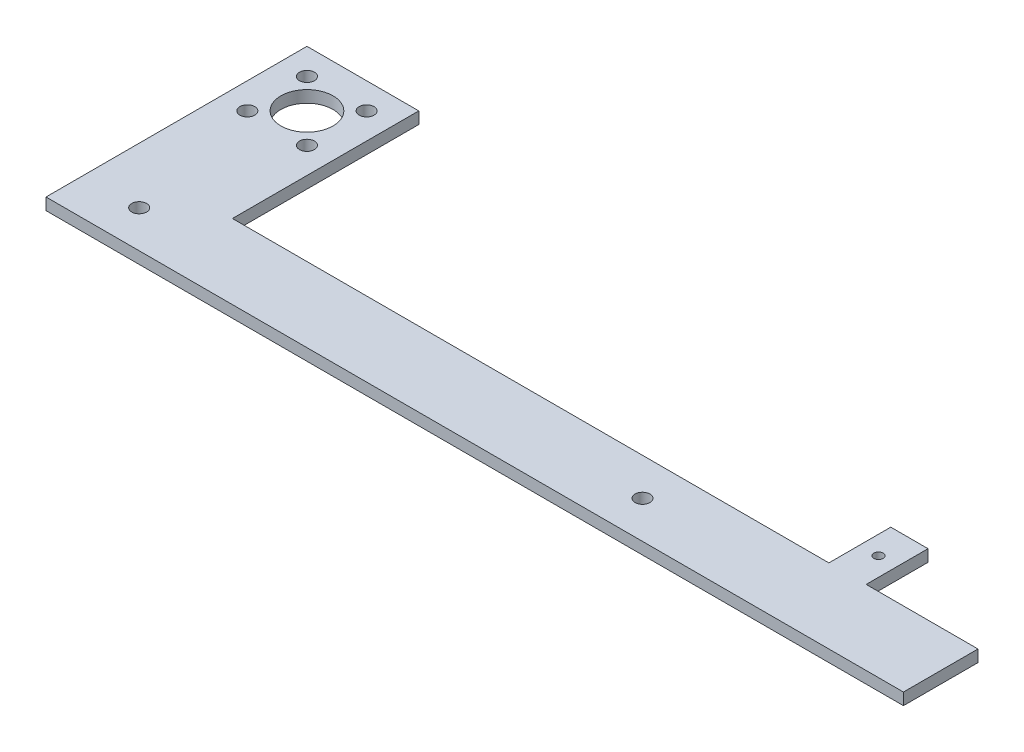
ISO-10303-21;
HEADER;
FILE_DESCRIPTION(('STEP AP214'),'2;1');
FILE_NAME('part.step','',(''),(''),'','','');
FILE_SCHEMA(('AUTOMOTIVE_DESIGN { 1 0 10303 214 1 1 1 1 }'));
ENDSEC;
DATA;
#1=APPLICATION_CONTEXT('core data for automotive mechanical design processes');
#2=APPLICATION_PROTOCOL_DEFINITION('international standard','automotive_design',2000,#1);
#3=PRODUCT_CONTEXT('',#1,'mechanical');
#4=PRODUCT('Part','Part','',(#3));
#5=PRODUCT_RELATED_PRODUCT_CATEGORY('part','',(#4));
#6=PRODUCT_DEFINITION_FORMATION('','',#4);
#7=PRODUCT_DEFINITION_CONTEXT('part definition',#1,'design');
#8=PRODUCT_DEFINITION('design','',#6,#7);
#9=PRODUCT_DEFINITION_SHAPE('','',#8);
#10=(LENGTH_UNIT() NAMED_UNIT(*) SI_UNIT(.MILLI.,.METRE.));
#11=(NAMED_UNIT(*) PLANE_ANGLE_UNIT() SI_UNIT($,.RADIAN.));
#12=(NAMED_UNIT(*) SI_UNIT($,.STERADIAN.) SOLID_ANGLE_UNIT());
#13=UNCERTAINTY_MEASURE_WITH_UNIT(LENGTH_MEASURE(1.E-05),#10,'distance_accuracy_value','');
#14=(GEOMETRIC_REPRESENTATION_CONTEXT(3) GLOBAL_UNCERTAINTY_ASSIGNED_CONTEXT((#13)) GLOBAL_UNIT_ASSIGNED_CONTEXT((#10,
#11,#12)) REPRESENTATION_CONTEXT('',''));
#15=CARTESIAN_POINT('',(0.,0.,0.));
#16=DIRECTION('',(0.,0.,1.));
#17=DIRECTION('',(1.,0.,0.));
#18=AXIS2_PLACEMENT_3D('',#15,#16,#17);
#19=CARTESIAN_POINT('',(0.,3.175,0.));
#20=DIRECTION('',(0.,0.,-1.));
#21=DIRECTION('',(-1.,0.,0.));
#22=AXIS2_PLACEMENT_3D('',#19,#20,#21);
#23=PLANE('',#22);
#24=DIRECTION('',(1.,0.,0.));
#25=VECTOR('',#24,1.);
#26=CARTESIAN_POINT('',(0.,0.,0.));
#27=LINE('',#26,#25);
#28=CARTESIAN_POINT('',(0.,0.,0.));
#29=VERTEX_POINT('',#28);
#30=CARTESIAN_POINT('',(230.,0.,0.));
#31=VERTEX_POINT('',#30);
#32=EDGE_CURVE('E170',#29,#31,#27,.T.);
#33=ORIENTED_EDGE('',*,*,#32,.T.);
#34=DIRECTION('',(0.,-1.,0.));
#35=VECTOR('',#34,1.);
#36=CARTESIAN_POINT('',(230.,3.175,0.));
#37=LINE('',#36,#35);
#38=CARTESIAN_POINT('',(230.,3.175,0.));
#39=VERTEX_POINT('',#38);
#40=EDGE_CURVE('E11',#39,#31,#37,.T.);
#41=ORIENTED_EDGE('',*,*,#40,.F.);
#42=DIRECTION('',(1.,0.,0.));
#43=VECTOR('',#42,1.);
#44=CARTESIAN_POINT('',(0.,3.175,0.));
#45=LINE('',#44,#43);
#46=CARTESIAN_POINT('',(0.,3.175,0.));
#47=VERTEX_POINT('',#46);
#48=EDGE_CURVE('E253',#47,#39,#45,.T.);
#49=ORIENTED_EDGE('',*,*,#48,.F.);
#50=DIRECTION('',(0.,-1.,0.));
#51=VECTOR('',#50,1.);
#52=CARTESIAN_POINT('',(0.,3.175,0.));
#53=LINE('',#52,#51);
#54=EDGE_CURVE('E52',#47,#29,#53,.T.);
#55=ORIENTED_EDGE('',*,*,#54,.T.);
#56=EDGE_LOOP('',(#33,#41,#49,#55));
#57=FACE_BOUND('',#56,.T.);
#58=ADVANCED_FACE('F35',(#57),#23,.F.);
#59=CARTESIAN_POINT('',(230.,3.175,0.));
#60=DIRECTION('',(-1.,0.,0.));
#61=DIRECTION('',(0.,0.,1.));
#62=AXIS2_PLACEMENT_3D('',#59,#60,#61);
#63=PLANE('',#62);
#64=DIRECTION('',(0.,0.,-1.));
#65=VECTOR('',#64,1.);
#66=CARTESIAN_POINT('',(230.,0.,0.));
#67=LINE('',#66,#65);
#68=CARTESIAN_POINT('',(230.,0.,-20.));
#69=VERTEX_POINT('',#68);
#70=EDGE_CURVE('E172',#31,#69,#67,.T.);
#71=ORIENTED_EDGE('',*,*,#70,.T.);
#72=DIRECTION('',(0.,-1.,0.));
#73=VECTOR('',#72,1.);
#74=CARTESIAN_POINT('',(230.,3.175,-20.));
#75=LINE('',#74,#73);
#76=CARTESIAN_POINT('',(230.,3.175,-20.));
#77=VERTEX_POINT('',#76);
#78=EDGE_CURVE('E44',#77,#69,#75,.T.);
#79=ORIENTED_EDGE('',*,*,#78,.F.);
#80=DIRECTION('',(0.,0.,-1.));
#81=VECTOR('',#80,1.);
#82=CARTESIAN_POINT('',(230.,3.175,0.));
#83=LINE('',#82,#81);
#84=EDGE_CURVE('E97',#39,#77,#83,.T.);
#85=ORIENTED_EDGE('',*,*,#84,.F.);
#86=ORIENTED_EDGE('',*,*,#40,.T.);
#87=EDGE_LOOP('',(#71,#79,#85,#86));
#88=FACE_BOUND('',#87,.T.);
#89=ADVANCED_FACE('F229',(#88),#63,.F.);
#90=CARTESIAN_POINT('',(0.,3.175,-20.));
#91=DIRECTION('',(0.,0.,-1.));
#92=DIRECTION('',(-1.,0.,0.));
#93=AXIS2_PLACEMENT_3D('',#90,#91,#92);
#94=PLANE('',#93);
#95=DIRECTION('',(1.,0.,0.));
#96=VECTOR('',#95,1.);
#97=CARTESIAN_POINT('',(0.,0.,-20.));
#98=LINE('',#97,#96);
#99=CARTESIAN_POINT('',(200.,0.,-20.));
#100=VERTEX_POINT('',#99);
#101=EDGE_CURVE('E175',#100,#69,#98,.T.);
#102=ORIENTED_EDGE('',*,*,#101,.F.);
#103=DIRECTION('',(0.,-1.,0.));
#104=VECTOR('',#103,1.);
#105=CARTESIAN_POINT('',(200.,3.175,-20.));
#106=LINE('',#105,#104);
#107=CARTESIAN_POINT('',(200.,3.175,-20.));
#108=VERTEX_POINT('',#107);
#109=EDGE_CURVE('E222',#108,#100,#106,.T.);
#110=ORIENTED_EDGE('',*,*,#109,.F.);
#111=DIRECTION('',(1.,0.,0.));
#112=VECTOR('',#111,1.);
#113=CARTESIAN_POINT('',(0.,3.175,-20.));
#114=LINE('',#113,#112);
#115=EDGE_CURVE('E228',#108,#77,#114,.T.);
#116=ORIENTED_EDGE('',*,*,#115,.T.);
#117=ORIENTED_EDGE('',*,*,#78,.T.);
#118=EDGE_LOOP('',(#102,#110,#116,#117));
#119=FACE_BOUND('',#118,.T.);
#120=ADVANCED_FACE('F226',(#119),#94,.T.);
#121=CARTESIAN_POINT('',(200.,3.175,0.));
#122=DIRECTION('',(-1.,0.,0.));
#123=DIRECTION('',(0.,0.,1.));
#124=AXIS2_PLACEMENT_3D('',#121,#122,#123);
#125=PLANE('',#124);
#126=DIRECTION('',(0.,0.,-1.));
#127=VECTOR('',#126,1.);
#128=CARTESIAN_POINT('',(200.,0.,0.));
#129=LINE('',#128,#127);
#130=CARTESIAN_POINT('',(200.,0.,-36.6));
#131=VERTEX_POINT('',#130);
#132=EDGE_CURVE('E178',#100,#131,#129,.T.);
#133=ORIENTED_EDGE('',*,*,#132,.T.);
#134=DIRECTION('',(0.,-1.,0.));
#135=VECTOR('',#134,1.);
#136=CARTESIAN_POINT('',(200.,3.175,-36.6));
#137=LINE('',#136,#135);
#138=CARTESIAN_POINT('',(200.,3.175,-36.6));
#139=VERTEX_POINT('',#138);
#140=EDGE_CURVE('E219',#139,#131,#137,.T.);
#141=ORIENTED_EDGE('',*,*,#140,.F.);
#142=DIRECTION('',(0.,0.,-1.));
#143=VECTOR('',#142,1.);
#144=CARTESIAN_POINT('',(200.,3.175,0.));
#145=LINE('',#144,#143);
#146=EDGE_CURVE('E247',#108,#139,#145,.T.);
#147=ORIENTED_EDGE('',*,*,#146,.F.);
#148=ORIENTED_EDGE('',*,*,#109,.T.);
#149=EDGE_LOOP('',(#133,#141,#147,#148));
#150=FACE_BOUND('',#149,.T.);
#151=ADVANCED_FACE('F238',(#150),#125,.F.);
#152=CARTESIAN_POINT('',(0.,3.175,-36.5999999999999));
#153=DIRECTION('',(0.,0.,1.));
#154=DIRECTION('',(1.,0.,0.));
#155=AXIS2_PLACEMENT_3D('',#152,#153,#154);
#156=PLANE('',#155);
#157=DIRECTION('',(-1.,0.,0.));
#158=VECTOR('',#157,1.);
#159=CARTESIAN_POINT('',(0.,0.,-36.5999999999999));
#160=LINE('',#159,#158);
#161=CARTESIAN_POINT('',(190.,0.,-36.6));
#162=VERTEX_POINT('',#161);
#163=EDGE_CURVE('E181',#131,#162,#160,.T.);
#164=ORIENTED_EDGE('',*,*,#163,.T.);
#165=DIRECTION('',(0.,-1.,0.));
#166=VECTOR('',#165,1.);
#167=CARTESIAN_POINT('',(190.,3.175,-36.6));
#168=LINE('',#167,#166);
#169=CARTESIAN_POINT('',(190.,3.175,-36.6));
#170=VERTEX_POINT('',#169);
#171=EDGE_CURVE('E217',#170,#162,#168,.T.);
#172=ORIENTED_EDGE('',*,*,#171,.F.);
#173=DIRECTION('',(-1.,0.,0.));
#174=VECTOR('',#173,1.);
#175=CARTESIAN_POINT('',(0.,3.175,-36.5999999999999));
#176=LINE('',#175,#174);
#177=EDGE_CURVE('E244',#139,#170,#176,.T.);
#178=ORIENTED_EDGE('',*,*,#177,.F.);
#179=ORIENTED_EDGE('',*,*,#140,.T.);
#180=EDGE_LOOP('',(#164,#172,#178,#179));
#181=FACE_BOUND('',#180,.T.);
#182=ADVANCED_FACE('F242',(#181),#156,.F.);
#183=CARTESIAN_POINT('',(190.,3.175,0.));
#184=DIRECTION('',(-1.,0.,0.));
#185=DIRECTION('',(0.,0.,1.));
#186=AXIS2_PLACEMENT_3D('',#183,#184,#185);
#187=PLANE('',#186);
#188=DIRECTION('',(0.,0.,-1.));
#189=VECTOR('',#188,1.);
#190=CARTESIAN_POINT('',(190.,0.,0.));
#191=LINE('',#190,#189);
#192=CARTESIAN_POINT('',(190.,0.,-20.));
#193=VERTEX_POINT('',#192);
#194=EDGE_CURVE('E184',#193,#162,#191,.T.);
#195=ORIENTED_EDGE('',*,*,#194,.F.);
#196=DIRECTION('',(0.,-1.,0.));
#197=VECTOR('',#196,1.);
#198=CARTESIAN_POINT('',(190.,3.175,-20.));
#199=LINE('',#198,#197);
#200=CARTESIAN_POINT('',(190.,3.175,-20.));
#201=VERTEX_POINT('',#200);
#202=EDGE_CURVE('E215',#201,#193,#199,.T.);
#203=ORIENTED_EDGE('',*,*,#202,.F.);
#204=DIRECTION('',(0.,0.,-1.));
#205=VECTOR('',#204,1.);
#206=CARTESIAN_POINT('',(190.,3.175,0.));
#207=LINE('',#206,#205);
#208=EDGE_CURVE('E246',#201,#170,#207,.T.);
#209=ORIENTED_EDGE('',*,*,#208,.T.);
#210=ORIENTED_EDGE('',*,*,#171,.T.);
#211=EDGE_LOOP('',(#195,#203,#209,#210));
#212=FACE_BOUND('',#211,.T.);
#213=ADVANCED_FACE('F292',(#212),#187,.T.);
#214=CARTESIAN_POINT('',(30.,0.,-20.));
#215=VERTEX_POINT('',#214);
#216=EDGE_CURVE('E179',#215,#193,#98,.T.);
#217=ORIENTED_EDGE('',*,*,#216,.F.);
#218=DIRECTION('',(0.,-1.,0.));
#219=VECTOR('',#218,1.);
#220=CARTESIAN_POINT('',(30.,3.175,-20.));
#221=LINE('',#220,#219);
#222=CARTESIAN_POINT('',(30.,3.175,-20.));
#223=VERTEX_POINT('',#222);
#224=EDGE_CURVE('E138',#223,#215,#221,.T.);
#225=ORIENTED_EDGE('',*,*,#224,.F.);
#226=EDGE_CURVE('E128',#223,#201,#114,.T.);
#227=ORIENTED_EDGE('',*,*,#226,.T.);
#228=ORIENTED_EDGE('',*,*,#202,.T.);
#229=EDGE_LOOP('',(#217,#225,#227,#228));
#230=FACE_BOUND('',#229,.T.);
#231=ADVANCED_FACE('F295',(#230),#94,.T.);
#232=CARTESIAN_POINT('',(30.,3.175,0.));
#233=DIRECTION('',(-1.,0.,0.));
#234=DIRECTION('',(0.,0.,1.));
#235=AXIS2_PLACEMENT_3D('',#232,#233,#234);
#236=PLANE('',#235);
#237=DIRECTION('',(0.,0.,-1.));
#238=VECTOR('',#237,1.);
#239=CARTESIAN_POINT('',(30.,0.,0.));
#240=LINE('',#239,#238);
#241=CARTESIAN_POINT('',(30.,0.,-70.));
#242=VERTEX_POINT('',#241);
#243=EDGE_CURVE('E135',#215,#242,#240,.T.);
#244=ORIENTED_EDGE('',*,*,#243,.T.);
#245=DIRECTION('',(0.,-1.,0.));
#246=VECTOR('',#245,1.);
#247=CARTESIAN_POINT('',(30.,3.175,-70.));
#248=LINE('',#247,#246);
#249=CARTESIAN_POINT('',(30.,3.175,-70.));
#250=VERTEX_POINT('',#249);
#251=EDGE_CURVE('E132',#250,#242,#248,.T.);
#252=ORIENTED_EDGE('',*,*,#251,.F.);
#253=DIRECTION('',(0.,0.,-1.));
#254=VECTOR('',#253,1.);
#255=CARTESIAN_POINT('',(30.,3.175,0.));
#256=LINE('',#255,#254);
#257=EDGE_CURVE('E119',#223,#250,#256,.T.);
#258=ORIENTED_EDGE('',*,*,#257,.F.);
#259=ORIENTED_EDGE('',*,*,#224,.T.);
#260=EDGE_LOOP('',(#244,#252,#258,#259));
#261=FACE_BOUND('',#260,.T.);
#262=ADVANCED_FACE('F133',(#261),#236,.F.);
#263=CARTESIAN_POINT('',(0.,3.175,-70.));
#264=DIRECTION('',(0.,0.,1.));
#265=DIRECTION('',(1.,0.,0.));
#266=AXIS2_PLACEMENT_3D('',#263,#264,#265);
#267=PLANE('',#266);
#268=DIRECTION('',(-1.,0.,0.));
#269=VECTOR('',#268,1.);
#270=CARTESIAN_POINT('',(0.,0.,-70.));
#271=LINE('',#270,#269);
#272=CARTESIAN_POINT('',(0.,0.,-70.));
#273=VERTEX_POINT('',#272);
#274=EDGE_CURVE('E188',#242,#273,#271,.T.);
#275=ORIENTED_EDGE('',*,*,#274,.T.);
#276=DIRECTION('',(0.,-1.,0.));
#277=VECTOR('',#276,1.);
#278=CARTESIAN_POINT('',(0.,3.175,-70.));
#279=LINE('',#278,#277);
#280=CARTESIAN_POINT('',(0.,3.175,-70.));
#281=VERTEX_POINT('',#280);
#282=EDGE_CURVE('E85',#281,#273,#279,.T.);
#283=ORIENTED_EDGE('',*,*,#282,.F.);
#284=DIRECTION('',(-1.,0.,0.));
#285=VECTOR('',#284,1.);
#286=CARTESIAN_POINT('',(0.,3.175,-70.));
#287=LINE('',#286,#285);
#288=EDGE_CURVE('E125',#250,#281,#287,.T.);
#289=ORIENTED_EDGE('',*,*,#288,.F.);
#290=ORIENTED_EDGE('',*,*,#251,.T.);
#291=EDGE_LOOP('',(#275,#283,#289,#290));
#292=FACE_BOUND('',#291,.T.);
#293=ADVANCED_FACE('F140',(#292),#267,.F.);
#294=CARTESIAN_POINT('',(22.9999999999999,3.175,-47.));
#295=DIRECTION('',(0.,-1.,0.));
#296=DIRECTION('',(0.,0.,-1.));
#297=AXIS2_PLACEMENT_3D('',#294,#295,#296);
#298=CYLINDRICAL_SURFACE('',#297,2.);
#299=CARTESIAN_POINT('',(22.9999999999999,3.175,-47.));
#300=DIRECTION('',(0.,1.,0.));
#301=DIRECTION('',(0.,0.,1.));
#302=AXIS2_PLACEMENT_3D('',#299,#300,#301);
#303=CIRCLE('',#302,2.);
#304=CARTESIAN_POINT('',(22.9999999999999,3.175,-45.));
#305=VERTEX_POINT('',#304);
#306=EDGE_CURVE('E158',#305,#305,#303,.T.);
#307=ORIENTED_EDGE('',*,*,#306,.T.);
#308=EDGE_LOOP('',(#307));
#309=FACE_BOUND('',#308,.T.);
#310=CARTESIAN_POINT('',(22.9999999999999,0.,-47.));
#311=DIRECTION('',(0.,1.,0.));
#312=DIRECTION('',(0.,0.,1.));
#313=AXIS2_PLACEMENT_3D('',#310,#311,#312);
#314=CIRCLE('',#313,2.);
#315=CARTESIAN_POINT('',(22.9999999999999,0.,-45.));
#316=VERTEX_POINT('',#315);
#317=EDGE_CURVE('E205',#316,#316,#314,.T.);
#318=ORIENTED_EDGE('',*,*,#317,.F.);
#319=EDGE_LOOP('',(#318));
#320=FACE_BOUND('',#319,.T.);
#321=ADVANCED_FACE('F304',(#309,#320),#298,.F.);
#322=CARTESIAN_POINT('',(23.,3.175,-63.));
#323=DIRECTION('',(0.,-1.,0.));
#324=DIRECTION('',(0.,0.,-1.));
#325=AXIS2_PLACEMENT_3D('',#322,#323,#324);
#326=CYLINDRICAL_SURFACE('',#325,2.);
#327=CARTESIAN_POINT('',(23.,3.175,-63.));
#328=DIRECTION('',(0.,1.,0.));
#329=DIRECTION('',(0.,0.,1.));
#330=AXIS2_PLACEMENT_3D('',#327,#328,#329);
#331=CIRCLE('',#330,2.);
#332=CARTESIAN_POINT('',(23.,3.175,-61.));
#333=VERTEX_POINT('',#332);
#334=EDGE_CURVE('E155',#333,#333,#331,.T.);
#335=ORIENTED_EDGE('',*,*,#334,.T.);
#336=EDGE_LOOP('',(#335));
#337=FACE_BOUND('',#336,.T.);
#338=CARTESIAN_POINT('',(23.,0.,-63.));
#339=DIRECTION('',(0.,1.,0.));
#340=DIRECTION('',(0.,0.,1.));
#341=AXIS2_PLACEMENT_3D('',#338,#339,#340);
#342=CIRCLE('',#341,2.);
#343=CARTESIAN_POINT('',(23.,0.,-61.));
#344=VERTEX_POINT('',#343);
#345=EDGE_CURVE('E202',#344,#344,#342,.T.);
#346=ORIENTED_EDGE('',*,*,#345,.F.);
#347=EDGE_LOOP('',(#346));
#348=FACE_BOUND('',#347,.T.);
#349=ADVANCED_FACE('F318',(#337,#348),#326,.F.);
#350=CARTESIAN_POINT('',(6.99999999999995,3.175,-63.));
#351=DIRECTION('',(0.,-1.,0.));
#352=DIRECTION('',(0.,0.,-1.));
#353=AXIS2_PLACEMENT_3D('',#350,#351,#352);
#354=CYLINDRICAL_SURFACE('',#353,2.);
#355=CARTESIAN_POINT('',(6.99999999999995,3.175,-63.));
#356=DIRECTION('',(0.,1.,0.));
#357=DIRECTION('',(0.,0.,1.));
#358=AXIS2_PLACEMENT_3D('',#355,#356,#357);
#359=CIRCLE('',#358,2.);
#360=CARTESIAN_POINT('',(6.99999999999995,3.175,-61.));
#361=VERTEX_POINT('',#360);
#362=EDGE_CURVE('E152',#361,#361,#359,.T.);
#363=ORIENTED_EDGE('',*,*,#362,.T.);
#364=EDGE_LOOP('',(#363));
#365=FACE_BOUND('',#364,.T.);
#366=CARTESIAN_POINT('',(6.99999999999995,0.,-63.));
#367=DIRECTION('',(0.,1.,0.));
#368=DIRECTION('',(0.,0.,1.));
#369=AXIS2_PLACEMENT_3D('',#366,#367,#368);
#370=CIRCLE('',#369,2.);
#371=CARTESIAN_POINT('',(6.99999999999995,0.,-61.));
#372=VERTEX_POINT('',#371);
#373=EDGE_CURVE('E199',#372,#372,#370,.T.);
#374=ORIENTED_EDGE('',*,*,#373,.F.);
#375=EDGE_LOOP('',(#374));
#376=FACE_BOUND('',#375,.T.);
#377=ADVANCED_FACE('F314',(#365,#376),#354,.F.);
#378=CARTESIAN_POINT('',(15.,3.175,-55.));
#379=DIRECTION('',(0.,-1.,0.));
#380=DIRECTION('',(0.,0.,-1.));
#381=AXIS2_PLACEMENT_3D('',#378,#379,#380);
#382=CYLINDRICAL_SURFACE('',#381,7.);
#383=CARTESIAN_POINT('',(15.,3.175,-55.));
#384=DIRECTION('',(0.,1.,0.));
#385=DIRECTION('',(0.,0.,1.));
#386=AXIS2_PLACEMENT_3D('',#383,#384,#385);
#387=CIRCLE('',#386,7.);
#388=CARTESIAN_POINT('',(15.,3.175,-48.));
#389=VERTEX_POINT('',#388);
#390=EDGE_CURVE('E149',#389,#389,#387,.T.);
#391=ORIENTED_EDGE('',*,*,#390,.T.);
#392=EDGE_LOOP('',(#391));
#393=FACE_BOUND('',#392,.T.);
#394=CARTESIAN_POINT('',(15.,0.,-55.));
#395=DIRECTION('',(0.,1.,0.));
#396=DIRECTION('',(0.,0.,1.));
#397=AXIS2_PLACEMENT_3D('',#394,#395,#396);
#398=CIRCLE('',#397,7.);
#399=CARTESIAN_POINT('',(15.,0.,-48.));
#400=VERTEX_POINT('',#399);
#401=EDGE_CURVE('E196',#400,#400,#398,.T.);
#402=ORIENTED_EDGE('',*,*,#401,.F.);
#403=EDGE_LOOP('',(#402));
#404=FACE_BOUND('',#403,.T.);
#405=ADVANCED_FACE('F310',(#393,#404),#382,.F.);
#406=CARTESIAN_POINT('',(195.,3.175,-28.3));
#407=DIRECTION('',(0.,-1.,0.));
#408=DIRECTION('',(0.,0.,-1.));
#409=AXIS2_PLACEMENT_3D('',#406,#407,#408);
#410=CYLINDRICAL_SURFACE('',#409,1.25000000000001);
#411=CARTESIAN_POINT('',(195.,3.175,-28.3));
#412=DIRECTION('',(0.,1.,0.));
#413=DIRECTION('',(0.,0.,1.));
#414=AXIS2_PLACEMENT_3D('',#411,#412,#413);
#415=CIRCLE('',#414,1.25000000000001);
#416=CARTESIAN_POINT('',(195.,3.175,-27.05));
#417=VERTEX_POINT('',#416);
#418=EDGE_CURVE('E143',#417,#417,#415,.T.);
#419=ORIENTED_EDGE('',*,*,#418,.T.);
#420=EDGE_LOOP('',(#419));
#421=FACE_BOUND('',#420,.T.);
#422=CARTESIAN_POINT('',(195.,0.,-28.3));
#423=DIRECTION('',(0.,1.,0.));
#424=DIRECTION('',(0.,0.,1.));
#425=AXIS2_PLACEMENT_3D('',#422,#423,#424);
#426=CIRCLE('',#425,1.25000000000001);
#427=CARTESIAN_POINT('',(195.,0.,-27.05));
#428=VERTEX_POINT('',#427);
#429=EDGE_CURVE('E193',#428,#428,#426,.T.);
#430=ORIENTED_EDGE('',*,*,#429,.F.);
#431=EDGE_LOOP('',(#430));
#432=FACE_BOUND('',#431,.T.);
#433=ADVANCED_FACE('F307',(#421,#432),#410,.F.);
#434=CARTESIAN_POINT('',(0.,3.175,0.));
#435=DIRECTION('',(-1.,0.,0.));
#436=DIRECTION('',(0.,0.,1.));
#437=AXIS2_PLACEMENT_3D('',#434,#435,#436);
#438=PLANE('',#437);
#439=DIRECTION('',(0.,0.,-1.));
#440=VECTOR('',#439,1.);
#441=CARTESIAN_POINT('',(0.,0.,0.));
#442=LINE('',#441,#440);
#443=EDGE_CURVE('E190',#29,#273,#442,.T.);
#444=ORIENTED_EDGE('',*,*,#443,.F.);
#445=ORIENTED_EDGE('',*,*,#54,.F.);
#446=DIRECTION('',(0.,0.,-1.));
#447=VECTOR('',#446,1.);
#448=CARTESIAN_POINT('',(0.,3.175,0.));
#449=LINE('',#448,#447);
#450=EDGE_CURVE('E141',#47,#281,#449,.T.);
#451=ORIENTED_EDGE('',*,*,#450,.T.);
#452=ORIENTED_EDGE('',*,*,#282,.T.);
#453=EDGE_LOOP('',(#444,#445,#451,#452));
#454=FACE_BOUND('',#453,.T.);
#455=ADVANCED_FACE('F272',(#454),#438,.T.);
#456=CARTESIAN_POINT('',(150.,3.175,-10.));
#457=DIRECTION('',(0.,-1.,0.));
#458=DIRECTION('',(0.,0.,-1.));
#459=AXIS2_PLACEMENT_3D('',#456,#457,#458);
#460=CYLINDRICAL_SURFACE('',#459,2.);
#461=CARTESIAN_POINT('',(150.,3.175,-10.));
#462=DIRECTION('',(0.,1.,0.));
#463=DIRECTION('',(0.,0.,1.));
#464=AXIS2_PLACEMENT_3D('',#461,#462,#463);
#465=CIRCLE('',#464,2.);
#466=CARTESIAN_POINT('',(150.,3.175,-8.00000000000001));
#467=VERTEX_POINT('',#466);
#468=EDGE_CURVE('E255',#467,#467,#465,.T.);
#469=ORIENTED_EDGE('',*,*,#468,.T.);
#470=EDGE_LOOP('',(#469));
#471=FACE_BOUND('',#470,.T.);
#472=CARTESIAN_POINT('',(150.,0.,-10.));
#473=DIRECTION('',(0.,1.,0.));
#474=DIRECTION('',(0.,0.,1.));
#475=AXIS2_PLACEMENT_3D('',#472,#473,#474);
#476=CIRCLE('',#475,2.);
#477=CARTESIAN_POINT('',(150.,0.,-8.00000000000001));
#478=VERTEX_POINT('',#477);
#479=EDGE_CURVE('E167',#478,#478,#476,.T.);
#480=ORIENTED_EDGE('',*,*,#479,.F.);
#481=EDGE_LOOP('',(#480));
#482=FACE_BOUND('',#481,.T.);
#483=ADVANCED_FACE('F269',(#471,#482),#460,.F.);
#484=CARTESIAN_POINT('',(15.,3.175,-9.99999999999998));
#485=DIRECTION('',(0.,-1.,0.));
#486=DIRECTION('',(0.,0.,-1.));
#487=AXIS2_PLACEMENT_3D('',#484,#485,#486);
#488=CYLINDRICAL_SURFACE('',#487,2.);
#489=CARTESIAN_POINT('',(15.,3.175,-9.99999999999998));
#490=DIRECTION('',(0.,1.,0.));
#491=DIRECTION('',(0.,0.,1.));
#492=AXIS2_PLACEMENT_3D('',#489,#490,#491);
#493=CIRCLE('',#492,2.);
#494=CARTESIAN_POINT('',(15.,3.175,-7.99999999999997));
#495=VERTEX_POINT('',#494);
#496=EDGE_CURVE('E211',#495,#495,#493,.T.);
#497=ORIENTED_EDGE('',*,*,#496,.T.);
#498=EDGE_LOOP('',(#497));
#499=FACE_BOUND('',#498,.T.);
#500=CARTESIAN_POINT('',(15.,0.,-9.99999999999998));
#501=DIRECTION('',(0.,1.,0.));
#502=DIRECTION('',(0.,0.,1.));
#503=AXIS2_PLACEMENT_3D('',#500,#501,#502);
#504=CIRCLE('',#503,2.);
#505=CARTESIAN_POINT('',(15.,0.,-7.99999999999997));
#506=VERTEX_POINT('',#505);
#507=EDGE_CURVE('E164',#506,#506,#504,.T.);
#508=ORIENTED_EDGE('',*,*,#507,.F.);
#509=EDGE_LOOP('',(#508));
#510=FACE_BOUND('',#509,.T.);
#511=ADVANCED_FACE('F37',(#499,#510),#488,.F.);
#512=CARTESIAN_POINT('',(6.99999999999992,3.175,-47.));
#513=DIRECTION('',(0.,-1.,0.));
#514=DIRECTION('',(0.,0.,-1.));
#515=AXIS2_PLACEMENT_3D('',#512,#513,#514);
#516=CYLINDRICAL_SURFACE('',#515,2.);
#517=CARTESIAN_POINT('',(6.99999999999992,3.175,-47.));
#518=DIRECTION('',(0.,1.,0.));
#519=DIRECTION('',(0.,0.,1.));
#520=AXIS2_PLACEMENT_3D('',#517,#518,#519);
#521=CIRCLE('',#520,2.);
#522=CARTESIAN_POINT('',(6.99999999999992,3.175,-45.));
#523=VERTEX_POINT('',#522);
#524=EDGE_CURVE('E161',#523,#523,#521,.T.);
#525=ORIENTED_EDGE('',*,*,#524,.T.);
#526=EDGE_LOOP('',(#525));
#527=FACE_BOUND('',#526,.T.);
#528=CARTESIAN_POINT('',(6.99999999999992,0.,-47.));
#529=DIRECTION('',(0.,1.,0.));
#530=DIRECTION('',(0.,0.,1.));
#531=AXIS2_PLACEMENT_3D('',#528,#529,#530);
#532=CIRCLE('',#531,2.);
#533=CARTESIAN_POINT('',(6.99999999999992,0.,-45.));
#534=VERTEX_POINT('',#533);
#535=EDGE_CURVE('E208',#534,#534,#532,.T.);
#536=ORIENTED_EDGE('',*,*,#535,.F.);
#537=EDGE_LOOP('',(#536));
#538=FACE_BOUND('',#537,.T.);
#539=ADVANCED_FACE('F265',(#527,#538),#516,.F.);
#540=CARTESIAN_POINT('',(0.,3.175,0.));
#541=DIRECTION('',(0.,1.,0.));
#542=DIRECTION('',(0.,0.,1.));
#543=AXIS2_PLACEMENT_3D('',#540,#541,#542);
#544=PLANE('',#543);
#545=ORIENTED_EDGE('',*,*,#496,.F.);
#546=EDGE_LOOP('',(#545));
#547=FACE_BOUND('',#546,.T.);
#548=ORIENTED_EDGE('',*,*,#468,.F.);
#549=EDGE_LOOP('',(#548));
#550=FACE_BOUND('',#549,.T.);
#551=ORIENTED_EDGE('',*,*,#48,.T.);
#552=ORIENTED_EDGE('',*,*,#84,.T.);
#553=ORIENTED_EDGE('',*,*,#115,.F.);
#554=ORIENTED_EDGE('',*,*,#146,.T.);
#555=ORIENTED_EDGE('',*,*,#177,.T.);
#556=ORIENTED_EDGE('',*,*,#208,.F.);
#557=ORIENTED_EDGE('',*,*,#226,.F.);
#558=ORIENTED_EDGE('',*,*,#257,.T.);
#559=ORIENTED_EDGE('',*,*,#288,.T.);
#560=ORIENTED_EDGE('',*,*,#450,.F.);
#561=EDGE_LOOP('',(#551,#552,#553,#554,#555,#556,#557,#558,#559,#560));
#562=FACE_BOUND('',#561,.T.);
#563=ORIENTED_EDGE('',*,*,#418,.F.);
#564=EDGE_LOOP('',(#563));
#565=FACE_BOUND('',#564,.T.);
#566=ORIENTED_EDGE('',*,*,#390,.F.);
#567=EDGE_LOOP('',(#566));
#568=FACE_BOUND('',#567,.T.);
#569=ORIENTED_EDGE('',*,*,#362,.F.);
#570=EDGE_LOOP('',(#569));
#571=FACE_BOUND('',#570,.T.);
#572=ORIENTED_EDGE('',*,*,#334,.F.);
#573=EDGE_LOOP('',(#572));
#574=FACE_BOUND('',#573,.T.);
#575=ORIENTED_EDGE('',*,*,#306,.F.);
#576=EDGE_LOOP('',(#575));
#577=FACE_BOUND('',#576,.T.);
#578=ORIENTED_EDGE('',*,*,#524,.F.);
#579=EDGE_LOOP('',(#578));
#580=FACE_BOUND('',#579,.T.);
#581=ADVANCED_FACE('F121',(#547,#550,#562,#565,#568,#571,#574,#577,#580),#544,.T.);
#582=CARTESIAN_POINT('',(0.,0.,0.));
#583=DIRECTION('',(0.,1.,0.));
#584=DIRECTION('',(0.,0.,1.));
#585=AXIS2_PLACEMENT_3D('',#582,#583,#584);
#586=PLANE('',#585);
#587=ORIENTED_EDGE('',*,*,#507,.T.);
#588=EDGE_LOOP('',(#587));
#589=FACE_BOUND('',#588,.T.);
#590=ORIENTED_EDGE('',*,*,#479,.T.);
#591=EDGE_LOOP('',(#590));
#592=FACE_BOUND('',#591,.T.);
#593=ORIENTED_EDGE('',*,*,#32,.F.);
#594=ORIENTED_EDGE('',*,*,#443,.T.);
#595=ORIENTED_EDGE('',*,*,#274,.F.);
#596=ORIENTED_EDGE('',*,*,#243,.F.);
#597=ORIENTED_EDGE('',*,*,#216,.T.);
#598=ORIENTED_EDGE('',*,*,#194,.T.);
#599=ORIENTED_EDGE('',*,*,#163,.F.);
#600=ORIENTED_EDGE('',*,*,#132,.F.);
#601=ORIENTED_EDGE('',*,*,#101,.T.);
#602=ORIENTED_EDGE('',*,*,#70,.F.);
#603=EDGE_LOOP('',(#593,#594,#595,#596,#597,#598,#599,#600,#601,#602));
#604=FACE_BOUND('',#603,.T.);
#605=ORIENTED_EDGE('',*,*,#429,.T.);
#606=EDGE_LOOP('',(#605));
#607=FACE_BOUND('',#606,.T.);
#608=ORIENTED_EDGE('',*,*,#401,.T.);
#609=EDGE_LOOP('',(#608));
#610=FACE_BOUND('',#609,.T.);
#611=ORIENTED_EDGE('',*,*,#373,.T.);
#612=EDGE_LOOP('',(#611));
#613=FACE_BOUND('',#612,.T.);
#614=ORIENTED_EDGE('',*,*,#345,.T.);
#615=EDGE_LOOP('',(#614));
#616=FACE_BOUND('',#615,.T.);
#617=ORIENTED_EDGE('',*,*,#317,.T.);
#618=EDGE_LOOP('',(#617));
#619=FACE_BOUND('',#618,.T.);
#620=ORIENTED_EDGE('',*,*,#535,.T.);
#621=EDGE_LOOP('',(#620));
#622=FACE_BOUND('',#621,.T.);
#623=ADVANCED_FACE('F233',(#589,#592,#604,#607,#610,#613,#616,#619,#622),#586,.F.);
#624=CLOSED_SHELL('',(#58,#89,#120,#151,#182,#213,#231,#262,#293,#321,#349,#377,#405,#433,#455,
#483,#511,#539,#581,#623));
#625=MANIFOLD_SOLID_BREP('B2',#624);
#626=ADVANCED_BREP_SHAPE_REPRESENTATION('',(#18,#625),#14);
#627=SHAPE_DEFINITION_REPRESENTATION(#9,#626);
ENDSEC;
END-ISO-10303-21;
